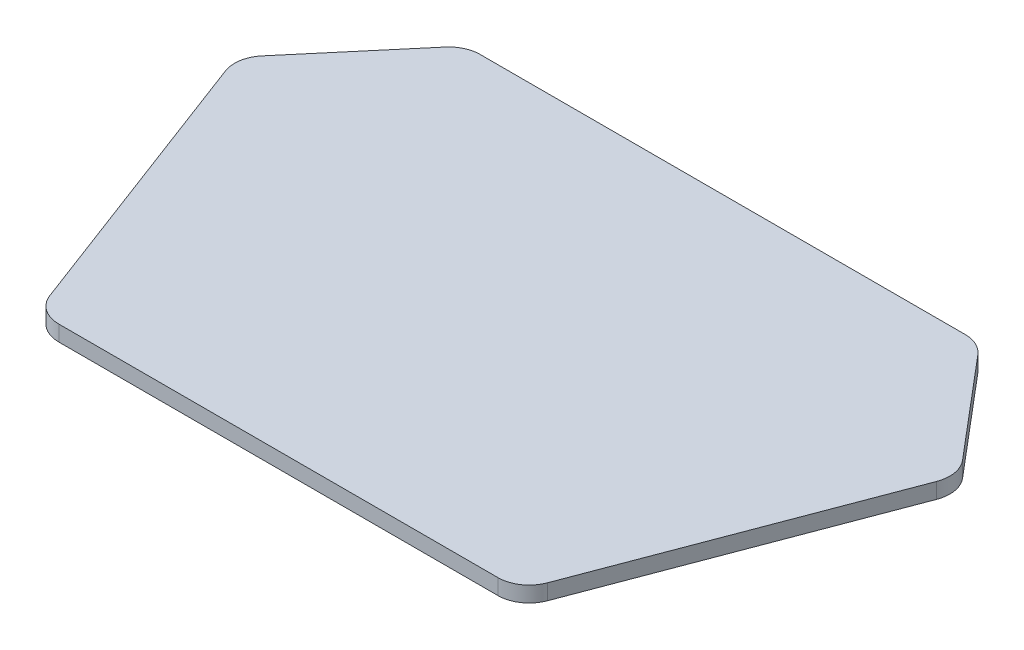
ISO-10303-21;
HEADER;
FILE_DESCRIPTION(('STEP AP214'),'2;1');
FILE_NAME('part.step','',(''),(''),'','','');
FILE_SCHEMA(('AUTOMOTIVE_DESIGN { 1 0 10303 214 1 1 1 1 }'));
ENDSEC;
DATA;
#1=APPLICATION_CONTEXT('core data for automotive mechanical design processes');
#2=APPLICATION_PROTOCOL_DEFINITION('international standard','automotive_design',2000,#1);
#3=PRODUCT_CONTEXT('',#1,'mechanical');
#4=PRODUCT('Part','Part','',(#3));
#5=PRODUCT_RELATED_PRODUCT_CATEGORY('part','',(#4));
#6=PRODUCT_DEFINITION_FORMATION('','',#4);
#7=PRODUCT_DEFINITION_CONTEXT('part definition',#1,'design');
#8=PRODUCT_DEFINITION('design','',#6,#7);
#9=PRODUCT_DEFINITION_SHAPE('','',#8);
#10=(LENGTH_UNIT() NAMED_UNIT(*) SI_UNIT(.MILLI.,.METRE.));
#11=(NAMED_UNIT(*) PLANE_ANGLE_UNIT() SI_UNIT($,.RADIAN.));
#12=(NAMED_UNIT(*) SI_UNIT($,.STERADIAN.) SOLID_ANGLE_UNIT());
#13=UNCERTAINTY_MEASURE_WITH_UNIT(LENGTH_MEASURE(1.E-05),#10,'distance_accuracy_value','');
#14=(GEOMETRIC_REPRESENTATION_CONTEXT(3) GLOBAL_UNCERTAINTY_ASSIGNED_CONTEXT((#13)) GLOBAL_UNIT_ASSIGNED_CONTEXT((#10,
#11,#12)) REPRESENTATION_CONTEXT('',''));
#15=CARTESIAN_POINT('',(0.,0.,0.));
#16=DIRECTION('',(0.,0.,1.));
#17=DIRECTION('',(1.,0.,0.));
#18=AXIS2_PLACEMENT_3D('',#15,#16,#17);
#19=CARTESIAN_POINT('',(-35.5875064778163,-2.286,-33.1839113300493));
#20=DIRECTION('',(0.,1.,0.));
#21=DIRECTION('',(0.,0.,1.));
#22=AXIS2_PLACEMENT_3D('',#19,#20,#21);
#23=CYLINDRICAL_SURFACE('',#22,4.572);
#24=CARTESIAN_POINT('',(-35.5875064778163,0.,-33.1839113300493));
#25=DIRECTION('',(0.,1.,0.));
#26=DIRECTION('',(0.,0.,1.));
#27=AXIS2_PLACEMENT_3D('',#24,#25,#26);
#28=CIRCLE('',#27,4.572);
#29=CARTESIAN_POINT('',(-35.5875064778163,0.,-37.7559113300493));
#30=VERTEX_POINT('',#29);
#31=CARTESIAN_POINT('',(-39.0789878169594,0.,-36.135646761692));
#32=VERTEX_POINT('',#31);
#33=EDGE_CURVE('E152',#30,#32,#28,.T.);
#34=ORIENTED_EDGE('',*,*,#33,.F.);
#35=DIRECTION('',(0.,1.,0.));
#36=VECTOR('',#35,1.);
#37=CARTESIAN_POINT('',(-35.5875064778163,-2.286,-37.7559113300493));
#38=LINE('',#37,#36);
#39=CARTESIAN_POINT('',(-35.5875064778163,-2.286,-37.7559113300493));
#40=VERTEX_POINT('',#39);
#41=EDGE_CURVE('E11',#40,#30,#38,.T.);
#42=ORIENTED_EDGE('',*,*,#41,.F.);
#43=CARTESIAN_POINT('',(-35.5875064778163,-2.286,-33.1839113300493));
#44=DIRECTION('',(0.,1.,0.));
#45=DIRECTION('',(0.,0.,1.));
#46=AXIS2_PLACEMENT_3D('',#43,#44,#45);
#47=CIRCLE('',#46,4.572);
#48=CARTESIAN_POINT('',(-39.0789878169594,-2.286,-36.135646761692));
#49=VERTEX_POINT('',#48);
#50=EDGE_CURVE('E184',#40,#49,#47,.T.);
#51=ORIENTED_EDGE('',*,*,#50,.T.);
#52=DIRECTION('',(0.,1.,0.));
#53=VECTOR('',#52,1.);
#54=CARTESIAN_POINT('',(-39.0789878169594,-2.286,-36.135646761692));
#55=LINE('',#54,#53);
#56=EDGE_CURVE('E34',#49,#32,#55,.T.);
#57=ORIENTED_EDGE('',*,*,#56,.T.);
#58=EDGE_LOOP('',(#34,#42,#51,#57));
#59=FACE_BOUND('',#58,.T.);
#60=ADVANCED_FACE('F31',(#59),#23,.T.);
#61=CARTESIAN_POINT('',(-35.5875064778163,-2.286,-37.7559113300493));
#62=DIRECTION('',(0.,0.,-1.));
#63=DIRECTION('',(-1.,0.,0.));
#64=AXIS2_PLACEMENT_3D('',#61,#62,#63);
#65=PLANE('',#64);
#66=DIRECTION('',(-1.,0.,0.));
#67=VECTOR('',#66,1.);
#68=CARTESIAN_POINT('',(-35.5875064778163,0.,-37.7559113300493));
#69=LINE('',#68,#67);
#70=CARTESIAN_POINT('',(35.5875064778163,0.,-37.7559113300493));
#71=VERTEX_POINT('',#70);
#72=EDGE_CURVE('E182',#71,#30,#69,.T.);
#73=ORIENTED_EDGE('',*,*,#72,.F.);
#74=DIRECTION('',(0.,1.,0.));
#75=VECTOR('',#74,1.);
#76=CARTESIAN_POINT('',(35.5875064778163,-2.286,-37.7559113300493));
#77=LINE('',#76,#75);
#78=CARTESIAN_POINT('',(35.5875064778163,-2.286,-37.7559113300493));
#79=VERTEX_POINT('',#78);
#80=EDGE_CURVE('E40',#79,#71,#77,.T.);
#81=ORIENTED_EDGE('',*,*,#80,.F.);
#82=DIRECTION('',(-1.,0.,0.));
#83=VECTOR('',#82,1.);
#84=CARTESIAN_POINT('',(-35.5875064778163,-2.286,-37.7559113300493));
#85=LINE('',#84,#83);
#86=EDGE_CURVE('E142',#79,#40,#85,.T.);
#87=ORIENTED_EDGE('',*,*,#86,.T.);
#88=ORIENTED_EDGE('',*,*,#41,.T.);
#89=EDGE_LOOP('',(#73,#81,#87,#88));
#90=FACE_BOUND('',#89,.T.);
#91=ADVANCED_FACE('F204',(#90),#65,.T.);
#92=CARTESIAN_POINT('',(35.5875064778163,-2.286,-33.1839113300493));
#93=DIRECTION('',(0.,1.,0.));
#94=DIRECTION('',(0.,0.,1.));
#95=AXIS2_PLACEMENT_3D('',#92,#93,#94);
#96=CYLINDRICAL_SURFACE('',#95,4.572);
#97=CARTESIAN_POINT('',(35.5875064778163,0.,-33.1839113300493));
#98=DIRECTION('',(0.,1.,0.));
#99=DIRECTION('',(0.,0.,1.));
#100=AXIS2_PLACEMENT_3D('',#97,#98,#99);
#101=CIRCLE('',#100,4.572);
#102=CARTESIAN_POINT('',(39.0789878169594,0.,-36.135646761692));
#103=VERTEX_POINT('',#102);
#104=EDGE_CURVE('E129',#103,#71,#101,.T.);
#105=ORIENTED_EDGE('',*,*,#104,.F.);
#106=DIRECTION('',(0.,1.,0.));
#107=VECTOR('',#106,1.);
#108=CARTESIAN_POINT('',(39.0789878169594,-2.286,-36.135646761692));
#109=LINE('',#108,#107);
#110=CARTESIAN_POINT('',(39.0789878169594,-2.286,-36.135646761692));
#111=VERTEX_POINT('',#110);
#112=EDGE_CURVE('E124',#111,#103,#109,.T.);
#113=ORIENTED_EDGE('',*,*,#112,.F.);
#114=CARTESIAN_POINT('',(35.5875064778163,-2.286,-33.1839113300493));
#115=DIRECTION('',(0.,1.,0.));
#116=DIRECTION('',(0.,0.,1.));
#117=AXIS2_PLACEMENT_3D('',#114,#115,#116);
#118=CIRCLE('',#117,4.572);
#119=EDGE_CURVE('E127',#111,#79,#118,.T.);
#120=ORIENTED_EDGE('',*,*,#119,.T.);
#121=ORIENTED_EDGE('',*,*,#80,.T.);
#122=EDGE_LOOP('',(#105,#113,#120,#121));
#123=FACE_BOUND('',#122,.T.);
#124=ADVANCED_FACE('F126',(#123),#96,.T.);
#125=CARTESIAN_POINT('',(39.0789878169594,-2.286,-36.135646761692));
#126=DIRECTION('',(0.763666084676977,0.,-0.645611424243822));
#127=DIRECTION('',(-0.645611424243822,0.,-0.763666084676977));
#128=AXIS2_PLACEMENT_3D('',#125,#126,#127);
#129=PLANE('',#128);
#130=DIRECTION('',(-0.645611424243822,0.,-0.763666084676977));
#131=VECTOR('',#130,1.);
#132=CARTESIAN_POINT('',(39.0789878169594,0.,-36.135646761692));
#133=LINE('',#132,#131);
#134=CARTESIAN_POINT('',(51.3921101503401,0.,-21.570982058779));
#135=VERTEX_POINT('',#134);
#136=EDGE_CURVE('E179',#135,#103,#133,.T.);
#137=ORIENTED_EDGE('',*,*,#136,.F.);
#138=DIRECTION('',(0.,1.,0.));
#139=VECTOR('',#138,1.);
#140=CARTESIAN_POINT('',(51.3921101503401,-2.286,-21.570982058779));
#141=LINE('',#140,#139);
#142=CARTESIAN_POINT('',(51.3921101503401,-2.286,-21.570982058779));
#143=VERTEX_POINT('',#142);
#144=EDGE_CURVE('E134',#143,#135,#141,.T.);
#145=ORIENTED_EDGE('',*,*,#144,.F.);
#146=DIRECTION('',(-0.645611424243822,0.,-0.763666084676977));
#147=VECTOR('',#146,1.);
#148=CARTESIAN_POINT('',(39.0789878169594,-2.286,-36.135646761692));
#149=LINE('',#148,#147);
#150=EDGE_CURVE('E140',#143,#111,#149,.T.);
#151=ORIENTED_EDGE('',*,*,#150,.T.);
#152=ORIENTED_EDGE('',*,*,#112,.T.);
#153=EDGE_LOOP('',(#137,#145,#151,#152));
#154=FACE_BOUND('',#153,.T.);
#155=ADVANCED_FACE('F144',(#154),#129,.T.);
#156=CARTESIAN_POINT('',(47.9006288111969,-2.286,-18.6192466271362));
#157=DIRECTION('',(0.,1.,0.));
#158=DIRECTION('',(0.,0.,1.));
#159=AXIS2_PLACEMENT_3D('',#156,#157,#158);
#160=CYLINDRICAL_SURFACE('',#159,4.572);
#161=CARTESIAN_POINT('',(47.9006288111969,0.,-18.6192466271362));
#162=DIRECTION('',(0.,1.,0.));
#163=DIRECTION('',(0.,0.,1.));
#164=AXIS2_PLACEMENT_3D('',#161,#162,#163);
#165=CIRCLE('',#164,4.572);
#166=CARTESIAN_POINT('',(52.1770789730604,0.,-17.0021016079441));
#167=VERTEX_POINT('',#166);
#168=EDGE_CURVE('E176',#167,#135,#165,.T.);
#169=ORIENTED_EDGE('',*,*,#168,.F.);
#170=DIRECTION('',(0.,1.,0.));
#171=VECTOR('',#170,1.);
#172=CARTESIAN_POINT('',(52.1770789730604,-2.286,-17.0021016079441));
#173=LINE('',#172,#171);
#174=CARTESIAN_POINT('',(52.1770789730604,-2.286,-17.0021016079441));
#175=VERTEX_POINT('',#174);
#176=EDGE_CURVE('E188',#175,#167,#173,.T.);
#177=ORIENTED_EDGE('',*,*,#176,.F.);
#178=CARTESIAN_POINT('',(47.9006288111969,-2.286,-18.6192466271362));
#179=DIRECTION('',(0.,1.,0.));
#180=DIRECTION('',(0.,0.,1.));
#181=AXIS2_PLACEMENT_3D('',#178,#179,#180);
#182=CIRCLE('',#181,4.572);
#183=EDGE_CURVE('E145',#175,#143,#182,.T.);
#184=ORIENTED_EDGE('',*,*,#183,.T.);
#185=ORIENTED_EDGE('',*,*,#144,.T.);
#186=EDGE_LOOP('',(#169,#177,#184,#185));
#187=FACE_BOUND('',#186,.T.);
#188=ADVANCED_FACE('F217',(#187),#160,.T.);
#189=CARTESIAN_POINT('',(52.1770789730604,-2.286,-17.0021016079441));
#190=DIRECTION('',(0.935356553338471,0.,0.353706259665809));
#191=DIRECTION('',(0.353706259665809,0.,-0.935356553338471));
#192=AXIS2_PLACEMENT_3D('',#189,#190,#191);
#193=PLANE('',#192);
#194=DIRECTION('',(0.353706259665809,0.,-0.935356553338471));
#195=VECTOR('',#194,1.);
#196=CARTESIAN_POINT('',(52.1770789730604,0.,-17.0021016079441));
#197=LINE('',#196,#195);
#198=CARTESIAN_POINT('',(36.4976051570357,0.,24.4613958166546));
#199=VERTEX_POINT('',#198);
#200=EDGE_CURVE('E173',#199,#167,#197,.T.);
#201=ORIENTED_EDGE('',*,*,#200,.F.);
#202=DIRECTION('',(0.,1.,0.));
#203=VECTOR('',#202,1.);
#204=CARTESIAN_POINT('',(36.4976051570357,-2.286,24.4613958166546));
#205=LINE('',#204,#203);
#206=CARTESIAN_POINT('',(36.4976051570357,-2.286,24.4613958166546));
#207=VERTEX_POINT('',#206);
#208=EDGE_CURVE('E190',#207,#199,#205,.T.);
#209=ORIENTED_EDGE('',*,*,#208,.F.);
#210=DIRECTION('',(0.353706259665809,0.,-0.935356553338471));
#211=VECTOR('',#210,1.);
#212=CARTESIAN_POINT('',(52.1770789730604,-2.286,-17.0021016079441));
#213=LINE('',#212,#211);
#214=EDGE_CURVE('E147',#207,#175,#213,.T.);
#215=ORIENTED_EDGE('',*,*,#214,.T.);
#216=ORIENTED_EDGE('',*,*,#176,.T.);
#217=EDGE_LOOP('',(#201,#209,#215,#216));
#218=FACE_BOUND('',#217,.T.);
#219=ADVANCED_FACE('F220',(#218),#193,.T.);
#220=CARTESIAN_POINT('',(32.2211549951722,-2.286,22.8442507974625));
#221=DIRECTION('',(0.,1.,0.));
#222=DIRECTION('',(0.,0.,1.));
#223=AXIS2_PLACEMENT_3D('',#220,#221,#222);
#224=CYLINDRICAL_SURFACE('',#223,4.572);
#225=CARTESIAN_POINT('',(32.2211549951722,0.,22.8442507974625));
#226=DIRECTION('',(0.,1.,0.));
#227=DIRECTION('',(0.,0.,-1.));
#228=AXIS2_PLACEMENT_3D('',#225,#226,#227);
#229=CIRCLE('',#228,4.572);
#230=CARTESIAN_POINT('',(32.2211549951722,0.,27.4162507974625));
#231=VERTEX_POINT('',#230);
#232=EDGE_CURVE('E170',#231,#199,#229,.T.);
#233=ORIENTED_EDGE('',*,*,#232,.F.);
#234=DIRECTION('',(0.,1.,0.));
#235=VECTOR('',#234,1.);
#236=CARTESIAN_POINT('',(32.2211549951722,-2.286,27.4162507974625));
#237=LINE('',#236,#235);
#238=CARTESIAN_POINT('',(32.2211549951722,-2.286,27.4162507974625));
#239=VERTEX_POINT('',#238);
#240=EDGE_CURVE('E192',#239,#231,#237,.T.);
#241=ORIENTED_EDGE('',*,*,#240,.F.);
#242=CARTESIAN_POINT('',(32.2211549951722,-2.286,22.8442507974625));
#243=DIRECTION('',(0.,1.,0.));
#244=DIRECTION('',(0.,0.,-1.));
#245=AXIS2_PLACEMENT_3D('',#242,#243,#244);
#246=CIRCLE('',#245,4.572);
#247=EDGE_CURVE('E346',#239,#207,#246,.T.);
#248=ORIENTED_EDGE('',*,*,#247,.T.);
#249=ORIENTED_EDGE('',*,*,#208,.T.);
#250=EDGE_LOOP('',(#233,#241,#248,#249));
#251=FACE_BOUND('',#250,.T.);
#252=ADVANCED_FACE('F224',(#251),#224,.T.);
#253=CARTESIAN_POINT('',(-32.2211549951722,-2.286,27.4162507974625));
#254=DIRECTION('',(0.,0.,1.));
#255=DIRECTION('',(1.,0.,0.));
#256=AXIS2_PLACEMENT_3D('',#253,#254,#255);
#257=PLANE('',#256);
#258=DIRECTION('',(1.,0.,0.));
#259=VECTOR('',#258,1.);
#260=CARTESIAN_POINT('',(-32.2211549951722,0.,27.4162507974625));
#261=LINE('',#260,#259);
#262=CARTESIAN_POINT('',(-32.2211549951722,0.,27.4162507974625));
#263=VERTEX_POINT('',#262);
#264=EDGE_CURVE('E167',#263,#231,#261,.T.);
#265=ORIENTED_EDGE('',*,*,#264,.F.);
#266=DIRECTION('',(0.,1.,0.));
#267=VECTOR('',#266,1.);
#268=CARTESIAN_POINT('',(-32.2211549951722,-2.286,27.4162507974625));
#269=LINE('',#268,#267);
#270=CARTESIAN_POINT('',(-32.2211549951722,-2.286,27.4162507974625));
#271=VERTEX_POINT('',#270);
#272=EDGE_CURVE('E194',#271,#263,#269,.T.);
#273=ORIENTED_EDGE('',*,*,#272,.F.);
#274=DIRECTION('',(1.,0.,0.));
#275=VECTOR('',#274,1.);
#276=CARTESIAN_POINT('',(-32.2211549951722,-2.286,27.4162507974625));
#277=LINE('',#276,#275);
#278=EDGE_CURVE('E350',#271,#239,#277,.T.);
#279=ORIENTED_EDGE('',*,*,#278,.T.);
#280=ORIENTED_EDGE('',*,*,#240,.T.);
#281=EDGE_LOOP('',(#265,#273,#279,#280));
#282=FACE_BOUND('',#281,.T.);
#283=ADVANCED_FACE('F228',(#282),#257,.T.);
#284=CARTESIAN_POINT('',(-32.2211549951722,-2.286,22.8442507974625));
#285=DIRECTION('',(0.,1.,0.));
#286=DIRECTION('',(0.,0.,1.));
#287=AXIS2_PLACEMENT_3D('',#284,#285,#286);
#288=CYLINDRICAL_SURFACE('',#287,4.572);
#289=CARTESIAN_POINT('',(-32.2211549951722,0.,22.8442507974625));
#290=DIRECTION('',(0.,1.,0.));
#291=DIRECTION('',(0.,0.,1.));
#292=AXIS2_PLACEMENT_3D('',#289,#290,#291);
#293=CIRCLE('',#292,4.572);
#294=CARTESIAN_POINT('',(-36.4976051570357,0.,24.4613958166545));
#295=VERTEX_POINT('',#294);
#296=EDGE_CURVE('E164',#295,#263,#293,.T.);
#297=ORIENTED_EDGE('',*,*,#296,.F.);
#298=DIRECTION('',(0.,1.,0.));
#299=VECTOR('',#298,1.);
#300=CARTESIAN_POINT('',(-36.4976051570357,-2.286,24.4613958166545));
#301=LINE('',#300,#299);
#302=CARTESIAN_POINT('',(-36.4976051570357,-2.286,24.4613958166545));
#303=VERTEX_POINT('',#302);
#304=EDGE_CURVE('E196',#303,#295,#301,.T.);
#305=ORIENTED_EDGE('',*,*,#304,.F.);
#306=CARTESIAN_POINT('',(-32.2211549951722,-2.286,22.8442507974625));
#307=DIRECTION('',(0.,1.,0.));
#308=DIRECTION('',(0.,0.,1.));
#309=AXIS2_PLACEMENT_3D('',#306,#307,#308);
#310=CIRCLE('',#309,4.572);
#311=EDGE_CURVE('E339',#303,#271,#310,.T.);
#312=ORIENTED_EDGE('',*,*,#311,.T.);
#313=ORIENTED_EDGE('',*,*,#272,.T.);
#314=EDGE_LOOP('',(#297,#305,#312,#313));
#315=FACE_BOUND('',#314,.T.);
#316=ADVANCED_FACE('F232',(#315),#288,.T.);
#317=CARTESIAN_POINT('',(-52.1770789730604,-2.286,-17.0021016079441));
#318=DIRECTION('',(-0.935356553338471,0.,0.353706259665809));
#319=DIRECTION('',(0.353706259665809,0.,0.935356553338471));
#320=AXIS2_PLACEMENT_3D('',#317,#318,#319);
#321=PLANE('',#320);
#322=DIRECTION('',(0.353706259665809,0.,0.935356553338471));
#323=VECTOR('',#322,1.);
#324=CARTESIAN_POINT('',(-52.1770789730604,0.,-17.0021016079441));
#325=LINE('',#324,#323);
#326=CARTESIAN_POINT('',(-52.1770789730604,0.,-17.0021016079441));
#327=VERTEX_POINT('',#326);
#328=EDGE_CURVE('E161',#327,#295,#325,.T.);
#329=ORIENTED_EDGE('',*,*,#328,.F.);
#330=DIRECTION('',(0.,1.,0.));
#331=VECTOR('',#330,1.);
#332=CARTESIAN_POINT('',(-52.1770789730604,-2.286,-17.0021016079441));
#333=LINE('',#332,#331);
#334=CARTESIAN_POINT('',(-52.1770789730604,-2.286,-17.0021016079441));
#335=VERTEX_POINT('',#334);
#336=EDGE_CURVE('E198',#335,#327,#333,.T.);
#337=ORIENTED_EDGE('',*,*,#336,.F.);
#338=DIRECTION('',(0.353706259665809,0.,0.935356553338471));
#339=VECTOR('',#338,1.);
#340=CARTESIAN_POINT('',(-52.1770789730604,-2.286,-17.0021016079441));
#341=LINE('',#340,#339);
#342=EDGE_CURVE('E335',#335,#303,#341,.T.);
#343=ORIENTED_EDGE('',*,*,#342,.T.);
#344=ORIENTED_EDGE('',*,*,#304,.T.);
#345=EDGE_LOOP('',(#329,#337,#343,#344));
#346=FACE_BOUND('',#345,.T.);
#347=ADVANCED_FACE('F236',(#346),#321,.T.);
#348=CARTESIAN_POINT('',(-47.9006288111969,-2.286,-18.6192466271362));
#349=DIRECTION('',(0.,1.,0.));
#350=DIRECTION('',(0.,0.,1.));
#351=AXIS2_PLACEMENT_3D('',#348,#349,#350);
#352=CYLINDRICAL_SURFACE('',#351,4.572);
#353=CARTESIAN_POINT('',(-47.9006288111969,0.,-18.6192466271362));
#354=DIRECTION('',(0.,1.,0.));
#355=DIRECTION('',(0.,0.,-1.));
#356=AXIS2_PLACEMENT_3D('',#353,#354,#355);
#357=CIRCLE('',#356,4.572);
#358=CARTESIAN_POINT('',(-51.3921101503401,0.,-21.570982058779));
#359=VERTEX_POINT('',#358);
#360=EDGE_CURVE('E158',#359,#327,#357,.T.);
#361=ORIENTED_EDGE('',*,*,#360,.F.);
#362=DIRECTION('',(0.,1.,0.));
#363=VECTOR('',#362,1.);
#364=CARTESIAN_POINT('',(-51.3921101503401,-2.286,-21.570982058779));
#365=LINE('',#364,#363);
#366=CARTESIAN_POINT('',(-51.3921101503401,-2.286,-21.570982058779));
#367=VERTEX_POINT('',#366);
#368=EDGE_CURVE('E199',#367,#359,#365,.T.);
#369=ORIENTED_EDGE('',*,*,#368,.F.);
#370=CARTESIAN_POINT('',(-47.9006288111969,-2.286,-18.6192466271362));
#371=DIRECTION('',(0.,1.,0.));
#372=DIRECTION('',(0.,0.,-1.));
#373=AXIS2_PLACEMENT_3D('',#370,#371,#372);
#374=CIRCLE('',#373,4.572);
#375=EDGE_CURVE('E356',#367,#335,#374,.T.);
#376=ORIENTED_EDGE('',*,*,#375,.T.);
#377=ORIENTED_EDGE('',*,*,#336,.T.);
#378=EDGE_LOOP('',(#361,#369,#376,#377));
#379=FACE_BOUND('',#378,.T.);
#380=ADVANCED_FACE('F240',(#379),#352,.T.);
#381=CARTESIAN_POINT('',(-39.0789878169594,-2.286,-36.135646761692));
#382=DIRECTION('',(-0.763666084676976,0.,-0.645611424243822));
#383=DIRECTION('',(-0.645611424243822,0.,0.763666084676977));
#384=AXIS2_PLACEMENT_3D('',#381,#382,#383);
#385=PLANE('',#384);
#386=DIRECTION('',(-0.645611424243822,0.,0.763666084676976));
#387=VECTOR('',#386,1.);
#388=CARTESIAN_POINT('',(-39.0789878169594,0.,-36.135646761692));
#389=LINE('',#388,#387);
#390=EDGE_CURVE('E155',#32,#359,#389,.T.);
#391=ORIENTED_EDGE('',*,*,#390,.F.);
#392=ORIENTED_EDGE('',*,*,#56,.F.);
#393=DIRECTION('',(-0.645611424243822,0.,0.763666084676976));
#394=VECTOR('',#393,1.);
#395=CARTESIAN_POINT('',(-39.0789878169594,-2.286,-36.135646761692));
#396=LINE('',#395,#394);
#397=EDGE_CURVE('E358',#49,#367,#396,.T.);
#398=ORIENTED_EDGE('',*,*,#397,.T.);
#399=ORIENTED_EDGE('',*,*,#368,.T.);
#400=EDGE_LOOP('',(#391,#392,#398,#399));
#401=FACE_BOUND('',#400,.T.);
#402=ADVANCED_FACE('F201',(#401),#385,.T.);
#403=CARTESIAN_POINT('',(-35.5875064778163,-2.286,-33.1839113300493));
#404=DIRECTION('',(0.,1.,0.));
#405=DIRECTION('',(0.,0.,1.));
#406=AXIS2_PLACEMENT_3D('',#403,#404,#405);
#407=PLANE('',#406);
#408=ORIENTED_EDGE('',*,*,#50,.F.);
#409=ORIENTED_EDGE('',*,*,#86,.F.);
#410=ORIENTED_EDGE('',*,*,#119,.F.);
#411=ORIENTED_EDGE('',*,*,#150,.F.);
#412=ORIENTED_EDGE('',*,*,#183,.F.);
#413=ORIENTED_EDGE('',*,*,#214,.F.);
#414=ORIENTED_EDGE('',*,*,#247,.F.);
#415=ORIENTED_EDGE('',*,*,#278,.F.);
#416=ORIENTED_EDGE('',*,*,#311,.F.);
#417=ORIENTED_EDGE('',*,*,#342,.F.);
#418=ORIENTED_EDGE('',*,*,#375,.F.);
#419=ORIENTED_EDGE('',*,*,#397,.F.);
#420=EDGE_LOOP('',(#408,#409,#410,#411,#412,#413,#414,#415,#416,#417,#418,#419));
#421=FACE_BOUND('',#420,.T.);
#422=ADVANCED_FACE('F138',(#421),#407,.F.);
#423=CARTESIAN_POINT('',(-35.5875064778163,0.,-33.1839113300493));
#424=DIRECTION('',(0.,1.,0.));
#425=DIRECTION('',(0.,0.,1.));
#426=AXIS2_PLACEMENT_3D('',#423,#424,#425);
#427=PLANE('',#426);
#428=ORIENTED_EDGE('',*,*,#33,.T.);
#429=ORIENTED_EDGE('',*,*,#390,.T.);
#430=ORIENTED_EDGE('',*,*,#360,.T.);
#431=ORIENTED_EDGE('',*,*,#328,.T.);
#432=ORIENTED_EDGE('',*,*,#296,.T.);
#433=ORIENTED_EDGE('',*,*,#264,.T.);
#434=ORIENTED_EDGE('',*,*,#232,.T.);
#435=ORIENTED_EDGE('',*,*,#200,.T.);
#436=ORIENTED_EDGE('',*,*,#168,.T.);
#437=ORIENTED_EDGE('',*,*,#136,.T.);
#438=ORIENTED_EDGE('',*,*,#104,.T.);
#439=ORIENTED_EDGE('',*,*,#72,.T.);
#440=EDGE_LOOP('',(#428,#429,#430,#431,#432,#433,#434,#435,#436,#437,#438,#439));
#441=FACE_BOUND('',#440,.T.);
#442=ADVANCED_FACE('F203',(#441),#427,.T.);
#443=CLOSED_SHELL('',(#60,#91,#124,#155,#188,#219,#252,#283,#316,#347,#380,#402,#422,#442));
#444=MANIFOLD_SOLID_BREP('B2',#443);
#445=ADVANCED_BREP_SHAPE_REPRESENTATION('',(#18,#444),#14);
#446=SHAPE_DEFINITION_REPRESENTATION(#9,#445);
ENDSEC;
END-ISO-10303-21;
